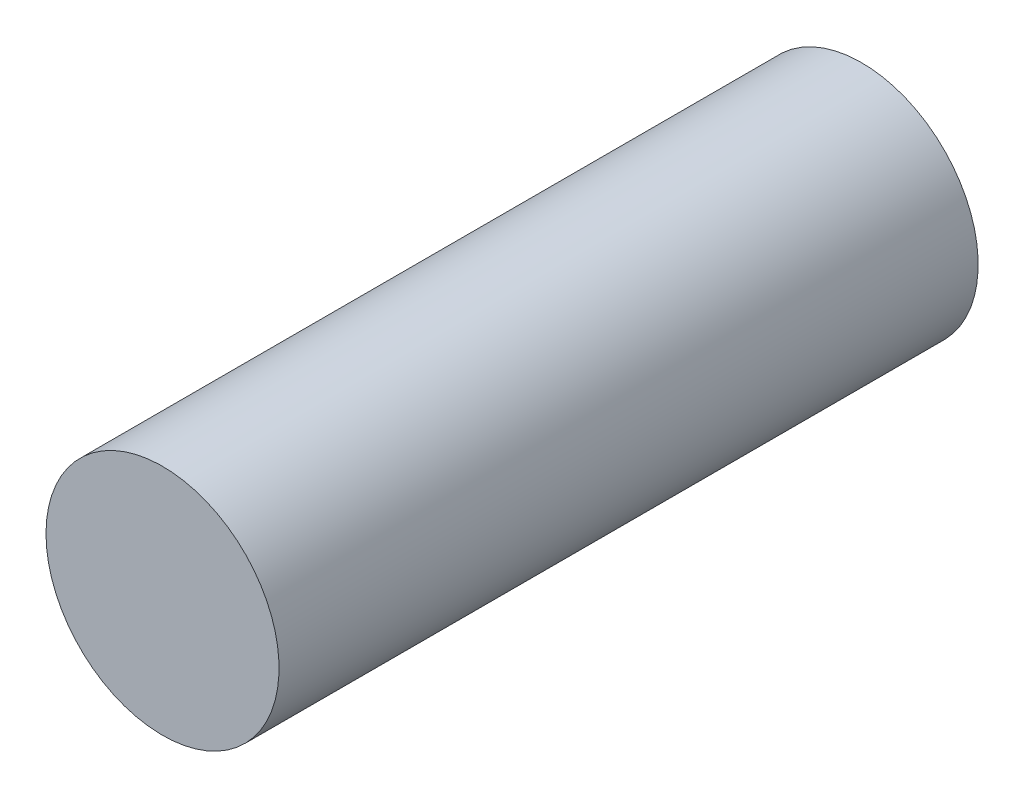
ISO-10303-21;
HEADER;
FILE_DESCRIPTION(('STEP AP214'),'2;1');
FILE_NAME('part.step','',(''),(''),'','','');
FILE_SCHEMA(('AUTOMOTIVE_DESIGN { 1 0 10303 214 1 1 1 1 }'));
ENDSEC;
DATA;
#1=APPLICATION_CONTEXT('core data for automotive mechanical design processes');
#2=APPLICATION_PROTOCOL_DEFINITION('international standard','automotive_design',2000,#1);
#3=PRODUCT_CONTEXT('',#1,'mechanical');
#4=PRODUCT('Part','Part','',(#3));
#5=PRODUCT_RELATED_PRODUCT_CATEGORY('part','',(#4));
#6=PRODUCT_DEFINITION_FORMATION('','',#4);
#7=PRODUCT_DEFINITION_CONTEXT('part definition',#1,'design');
#8=PRODUCT_DEFINITION('design','',#6,#7);
#9=PRODUCT_DEFINITION_SHAPE('','',#8);
#10=(LENGTH_UNIT() NAMED_UNIT(*) SI_UNIT(.MILLI.,.METRE.));
#11=(NAMED_UNIT(*) PLANE_ANGLE_UNIT() SI_UNIT($,.RADIAN.));
#12=(NAMED_UNIT(*) SI_UNIT($,.STERADIAN.) SOLID_ANGLE_UNIT());
#13=UNCERTAINTY_MEASURE_WITH_UNIT(LENGTH_MEASURE(1.E-05),#10,'distance_accuracy_value','');
#14=(GEOMETRIC_REPRESENTATION_CONTEXT(3) GLOBAL_UNCERTAINTY_ASSIGNED_CONTEXT((#13)) GLOBAL_UNIT_ASSIGNED_CONTEXT((#10,
#11,#12)) REPRESENTATION_CONTEXT('',''));
#15=CARTESIAN_POINT('',(0.,0.,0.));
#16=DIRECTION('',(0.,0.,1.));
#17=DIRECTION('',(1.,0.,0.));
#18=AXIS2_PLACEMENT_3D('',#15,#16,#17);
#19=CARTESIAN_POINT('',(0.,0.,19.05));
#20=DIRECTION('',(0.,0.,-1.));
#21=DIRECTION('',(-1.,0.,0.));
#22=AXIS2_PLACEMENT_3D('',#19,#20,#21);
#23=CYLINDRICAL_SURFACE('',#22,3.175);
#24=CARTESIAN_POINT('',(0.,0.,19.05));
#25=DIRECTION('',(0.,0.,1.));
#26=DIRECTION('',(1.,0.,0.));
#27=AXIS2_PLACEMENT_3D('',#24,#25,#26);
#28=CIRCLE('',#27,3.175);
#29=CARTESIAN_POINT('',(-3.175,0.,19.05));
#30=VERTEX_POINT('',#29);
#31=EDGE_CURVE('E10',#30,#30,#28,.T.);
#32=CARTESIAN_POINT('',(0.,0.,0.));
#33=DIRECTION('',(0.,0.,1.));
#34=DIRECTION('',(1.,0.,0.));
#35=AXIS2_PLACEMENT_3D('',#32,#33,#34);
#36=CIRCLE('',#35,3.175);
#37=CARTESIAN_POINT('',(-3.175,0.,0.));
#38=VERTEX_POINT('',#37);
#39=EDGE_CURVE('E37',#38,#38,#36,.T.);
#40=CARTESIAN_POINT('',(-3.175,0.,19.05));
#41=CARTESIAN_POINT('',(-3.175,0.,18.8515625));
#42=CARTESIAN_POINT('',(-3.175,0.,18.653125));
#43=CARTESIAN_POINT('',(-3.175,0.,18.25625));
#44=CARTESIAN_POINT('',(-3.175,0.,18.0578125));
#45=CARTESIAN_POINT('',(-3.175,0.,17.6609375));
#46=CARTESIAN_POINT('',(-3.175,0.,17.4625));
#47=CARTESIAN_POINT('',(-3.175,0.,17.065625));
#48=CARTESIAN_POINT('',(-3.175,0.,16.8671875));
#49=CARTESIAN_POINT('',(-3.175,0.,16.4703125));
#50=CARTESIAN_POINT('',(-3.175,0.,16.271875));
#51=CARTESIAN_POINT('',(-3.175,0.,15.875));
#52=CARTESIAN_POINT('',(-3.175,0.,15.6765625));
#53=CARTESIAN_POINT('',(-3.175,0.,15.2796875));
#54=CARTESIAN_POINT('',(-3.175,0.,15.08125));
#55=CARTESIAN_POINT('',(-3.175,0.,14.684375));
#56=CARTESIAN_POINT('',(-3.175,0.,14.4859375));
#57=CARTESIAN_POINT('',(-3.175,0.,14.0890625));
#58=CARTESIAN_POINT('',(-3.175,0.,13.890625));
#59=CARTESIAN_POINT('',(-3.175,0.,13.49375));
#60=CARTESIAN_POINT('',(-3.175,0.,13.2953125));
#61=CARTESIAN_POINT('',(-3.175,0.,12.8984375));
#62=CARTESIAN_POINT('',(-3.175,0.,12.7));
#63=CARTESIAN_POINT('',(-3.175,0.,12.303125));
#64=CARTESIAN_POINT('',(-3.175,0.,12.1046875));
#65=CARTESIAN_POINT('',(-3.175,0.,11.7078125));
#66=CARTESIAN_POINT('',(-3.175,0.,11.509375));
#67=CARTESIAN_POINT('',(-3.175,0.,11.1125));
#68=CARTESIAN_POINT('',(-3.175,0.,10.9140625));
#69=CARTESIAN_POINT('',(-3.175,0.,10.5171875));
#70=CARTESIAN_POINT('',(-3.175,0.,10.31875));
#71=CARTESIAN_POINT('',(-3.175,0.,9.921875));
#72=CARTESIAN_POINT('',(-3.175,0.,9.7234375));
#73=CARTESIAN_POINT('',(-3.175,0.,9.3265625));
#74=CARTESIAN_POINT('',(-3.175,0.,9.128125));
#75=CARTESIAN_POINT('',(-3.175,0.,8.73125));
#76=CARTESIAN_POINT('',(-3.175,0.,8.5328125));
#77=CARTESIAN_POINT('',(-3.175,0.,8.1359375));
#78=CARTESIAN_POINT('',(-3.175,0.,7.9375));
#79=CARTESIAN_POINT('',(-3.175,0.,7.540625));
#80=CARTESIAN_POINT('',(-3.175,0.,7.3421875));
#81=CARTESIAN_POINT('',(-3.175,0.,6.9453125));
#82=CARTESIAN_POINT('',(-3.175,0.,6.746875));
#83=CARTESIAN_POINT('',(-3.175,0.,6.35));
#84=CARTESIAN_POINT('',(-3.175,0.,6.1515625));
#85=CARTESIAN_POINT('',(-3.175,0.,5.7546875));
#86=CARTESIAN_POINT('',(-3.175,0.,5.55625));
#87=CARTESIAN_POINT('',(-3.175,0.,5.159375));
#88=CARTESIAN_POINT('',(-3.175,0.,4.9609375));
#89=CARTESIAN_POINT('',(-3.175,0.,4.5640625));
#90=CARTESIAN_POINT('',(-3.175,0.,4.365625));
#91=CARTESIAN_POINT('',(-3.175,0.,3.96875));
#92=CARTESIAN_POINT('',(-3.175,0.,3.7703125));
#93=CARTESIAN_POINT('',(-3.175,0.,3.3734375));
#94=CARTESIAN_POINT('',(-3.175,0.,3.175));
#95=CARTESIAN_POINT('',(-3.175,0.,2.778125));
#96=CARTESIAN_POINT('',(-3.175,0.,2.5796875));
#97=CARTESIAN_POINT('',(-3.175,0.,2.1828125));
#98=CARTESIAN_POINT('',(-3.175,0.,1.984375));
#99=CARTESIAN_POINT('',(-3.175,0.,1.5875));
#100=CARTESIAN_POINT('',(-3.175,0.,1.3890625));
#101=CARTESIAN_POINT('',(-3.175,0.,0.992187500000001));
#102=CARTESIAN_POINT('',(-3.175,0.,0.793750000000001));
#103=CARTESIAN_POINT('',(-3.175,0.,0.396875));
#104=CARTESIAN_POINT('',(-3.175,0.,0.1984375));
#105=CARTESIAN_POINT('',(-3.175,0.,0.));
#106=B_SPLINE_CURVE_WITH_KNOTS('',3,(#40,#41,#42,#43,#44,#45,#46,#47,#48,#49,#50,#51,#52,#53,
#54,#55,#56,#57,#58,#59,#60,#61,#62,#63,#64,#65,#66,#67,#68,#69,#70,#71,#72,#73,#74,#75,#76,#77,
#78,#79,#80,#81,#82,#83,#84,#85,#86,#87,#88,#89,#90,#91,#92,#93,#94,#95,#96,#97,#98,#99,#100,
#101,#102,#103,#104,#105),.UNSPECIFIED.,.F.,.F.,(4,2,2,2,2,2,2,2,2,2,2,2,2,2,2,2,2,2,2,2,2,2,2,
2,2,2,2,2,2,2,2,2,4),(0.,0.595312499999997,1.190625,1.7859375,2.38125,2.9765625,3.571875,
4.1671875,4.7625,5.3578125,5.953125,6.5484375,7.14375,7.7390625,8.334375,8.9296875,9.525,
10.1203125,10.715625,11.3109375,11.90625,12.5015625,13.096875,13.6921875,14.2875,14.8828125,
15.478125,16.0734375,16.66875,17.2640625,17.859375,18.4546875,19.05),.UNSPECIFIED.);
#107=EDGE_CURVE('BSEAM34',#30,#38,#106,.T.);
#108=ORIENTED_EDGE('',*,*,#31,.F.);
#109=ORIENTED_EDGE('',*,*,#39,.T.);
#110=ORIENTED_EDGE('',*,*,#107,.T.);
#111=ORIENTED_EDGE('',*,*,#107,.F.);
#112=EDGE_LOOP('',(#108,#110,#109,#111));
#113=FACE_BOUND('',#112,.T.);
#114=ADVANCED_FACE('F34',(#113),#23,.T.);
#115=CARTESIAN_POINT('',(0.,0.,19.05));
#116=DIRECTION('',(0.,0.,1.));
#117=DIRECTION('',(1.,0.,0.));
#118=AXIS2_PLACEMENT_3D('',#115,#116,#117);
#119=PLANE('',#118);
#120=ORIENTED_EDGE('',*,*,#31,.T.);
#121=EDGE_LOOP('',(#120));
#122=FACE_BOUND('',#121,.T.);
#123=ADVANCED_FACE('F49',(#122),#119,.T.);
#124=CARTESIAN_POINT('',(0.,0.,0.));
#125=DIRECTION('',(0.,0.,1.));
#126=DIRECTION('',(1.,0.,0.));
#127=AXIS2_PLACEMENT_3D('',#124,#125,#126);
#128=PLANE('',#127);
#129=ORIENTED_EDGE('',*,*,#39,.F.);
#130=EDGE_LOOP('',(#129));
#131=FACE_BOUND('',#130,.T.);
#132=ADVANCED_FACE('F47',(#131),#128,.F.);
#133=CLOSED_SHELL('',(#114,#123,#132));
#134=MANIFOLD_SOLID_BREP('B2',#133);
#135=ADVANCED_BREP_SHAPE_REPRESENTATION('',(#18,#134),#14);
#136=SHAPE_DEFINITION_REPRESENTATION(#9,#135);
ENDSEC;
END-ISO-10303-21;
